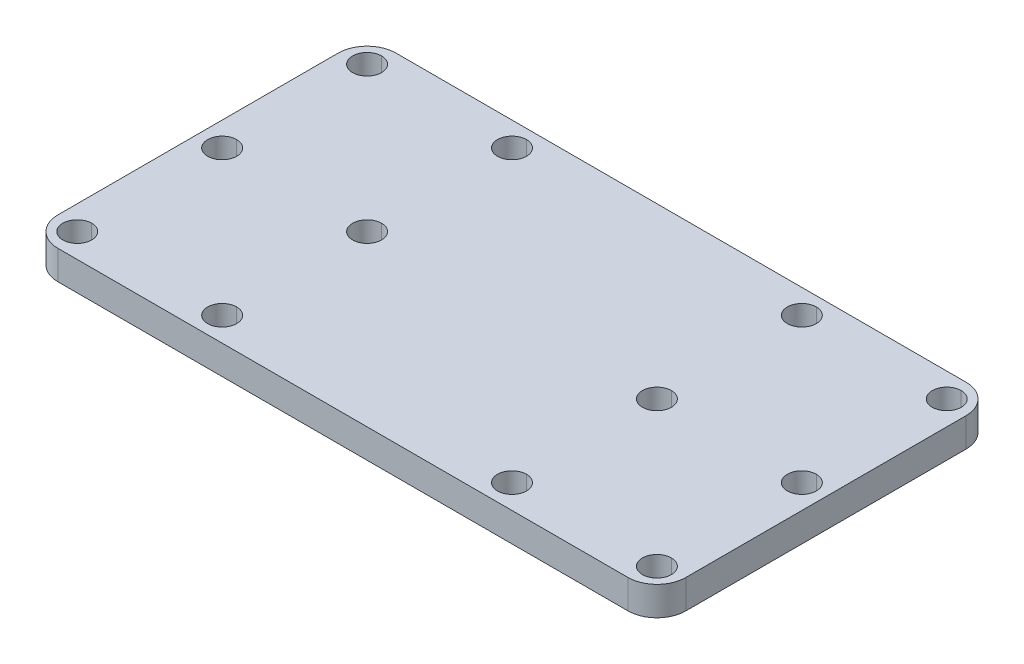
ISO-10303-21;
HEADER;
FILE_DESCRIPTION(('STEP AP214'),'2;1');
FILE_NAME('part.step','',(''),(''),'','','');
FILE_SCHEMA(('AUTOMOTIVE_DESIGN { 1 0 10303 214 1 1 1 1 }'));
ENDSEC;
DATA;
#1=APPLICATION_CONTEXT('core data for automotive mechanical design processes');
#2=APPLICATION_PROTOCOL_DEFINITION('international standard','automotive_design',2000,#1);
#3=PRODUCT_CONTEXT('',#1,'mechanical');
#4=PRODUCT('Part','Part','',(#3));
#5=PRODUCT_RELATED_PRODUCT_CATEGORY('part','',(#4));
#6=PRODUCT_DEFINITION_FORMATION('','',#4);
#7=PRODUCT_DEFINITION_CONTEXT('part definition',#1,'design');
#8=PRODUCT_DEFINITION('design','',#6,#7);
#9=PRODUCT_DEFINITION_SHAPE('','',#8);
#10=(LENGTH_UNIT() NAMED_UNIT(*) SI_UNIT(.MILLI.,.METRE.));
#11=(NAMED_UNIT(*) PLANE_ANGLE_UNIT() SI_UNIT($,.RADIAN.));
#12=(NAMED_UNIT(*) SI_UNIT($,.STERADIAN.) SOLID_ANGLE_UNIT());
#13=UNCERTAINTY_MEASURE_WITH_UNIT(LENGTH_MEASURE(1.E-05),#10,'distance_accuracy_value','');
#14=(GEOMETRIC_REPRESENTATION_CONTEXT(3) GLOBAL_UNCERTAINTY_ASSIGNED_CONTEXT((#13)) GLOBAL_UNIT_ASSIGNED_CONTEXT((#10,
#11,#12)) REPRESENTATION_CONTEXT('',''));
#15=CARTESIAN_POINT('',(0.,0.,0.));
#16=DIRECTION('',(0.,0.,1.));
#17=DIRECTION('',(1.,0.,0.));
#18=AXIS2_PLACEMENT_3D('',#15,#16,#17);
#19=CARTESIAN_POINT('',(-15.,-7.,-15.));
#20=DIRECTION('',(0.,1.,0.));
#21=DIRECTION('',(0.,0.,1.));
#22=AXIS2_PLACEMENT_3D('',#19,#20,#21);
#23=CYLINDRICAL_SURFACE('',#22,1.5);
#24=DIRECTION('',(0.,1.,0.));
#25=VECTOR('',#24,1.);
#26=CARTESIAN_POINT('',(-15.,-7.,-16.5));
#27=LINE('',#26,#25);
#28=CARTESIAN_POINT('',(-15.,0.,-16.5));
#29=VERTEX_POINT('',#28);
#30=CARTESIAN_POINT('',(-15.,3.,-16.5));
#31=VERTEX_POINT('',#30);
#32=EDGE_CURVE('E640',#29,#31,#27,.T.);
#33=ORIENTED_EDGE('',*,*,#32,.F.);
#34=CARTESIAN_POINT('',(-15.,0.,-15.));
#35=DIRECTION('',(0.,1.,0.));
#36=DIRECTION('',(0.,0.,1.));
#37=AXIS2_PLACEMENT_3D('',#34,#35,#36);
#38=CIRCLE('',#37,1.5);
#39=CARTESIAN_POINT('',(-15.,0.,-13.5));
#40=VERTEX_POINT('',#39);
#41=EDGE_CURVE('E222',#40,#29,#38,.T.);
#42=ORIENTED_EDGE('',*,*,#41,.F.);
#43=DIRECTION('',(0.,1.,0.));
#44=VECTOR('',#43,1.);
#45=CARTESIAN_POINT('',(-15.,-7.,-13.5));
#46=LINE('',#45,#44);
#47=CARTESIAN_POINT('',(-15.,3.,-13.5));
#48=VERTEX_POINT('',#47);
#49=EDGE_CURVE('E650',#40,#48,#46,.T.);
#50=ORIENTED_EDGE('',*,*,#49,.T.);
#51=CARTESIAN_POINT('',(-15.,3.,-15.));
#52=DIRECTION('',(0.,1.,0.));
#53=DIRECTION('',(0.,0.,1.));
#54=AXIS2_PLACEMENT_3D('',#51,#52,#53);
#55=CIRCLE('',#54,1.5);
#56=EDGE_CURVE('E200',#48,#31,#55,.T.);
#57=ORIENTED_EDGE('',*,*,#56,.T.);
#58=EDGE_LOOP('',(#33,#42,#50,#57));
#59=FACE_BOUND('',#58,.T.);
#60=ADVANCED_FACE('F16',(#59),#23,.F.);
#61=CARTESIAN_POINT('',(-15.,-7.,15.));
#62=DIRECTION('',(0.,1.,0.));
#63=DIRECTION('',(0.,0.,1.));
#64=AXIS2_PLACEMENT_3D('',#61,#62,#63);
#65=CYLINDRICAL_SURFACE('',#64,1.5);
#66=DIRECTION('',(0.,1.,0.));
#67=VECTOR('',#66,1.);
#68=CARTESIAN_POINT('',(-15.,-7.,13.5));
#69=LINE('',#68,#67);
#70=CARTESIAN_POINT('',(-15.,0.,13.5));
#71=VERTEX_POINT('',#70);
#72=CARTESIAN_POINT('',(-15.,3.,13.5));
#73=VERTEX_POINT('',#72);
#74=EDGE_CURVE('E665',#71,#73,#69,.T.);
#75=ORIENTED_EDGE('',*,*,#74,.F.);
#76=CARTESIAN_POINT('',(-15.,0.,15.));
#77=DIRECTION('',(0.,1.,0.));
#78=DIRECTION('',(0.,0.,1.));
#79=AXIS2_PLACEMENT_3D('',#76,#77,#78);
#80=CIRCLE('',#79,1.5);
#81=CARTESIAN_POINT('',(-15.,0.,16.5));
#82=VERTEX_POINT('',#81);
#83=EDGE_CURVE('E226',#82,#71,#80,.T.);
#84=ORIENTED_EDGE('',*,*,#83,.F.);
#85=DIRECTION('',(0.,1.,0.));
#86=VECTOR('',#85,1.);
#87=CARTESIAN_POINT('',(-15.,-7.,16.5));
#88=LINE('',#87,#86);
#89=CARTESIAN_POINT('',(-15.,3.,16.5));
#90=VERTEX_POINT('',#89);
#91=EDGE_CURVE('E664',#82,#90,#88,.T.);
#92=ORIENTED_EDGE('',*,*,#91,.T.);
#93=CARTESIAN_POINT('',(-15.,3.,15.));
#94=DIRECTION('',(0.,1.,0.));
#95=DIRECTION('',(0.,0.,1.));
#96=AXIS2_PLACEMENT_3D('',#93,#94,#95);
#97=CIRCLE('',#96,1.5);
#98=EDGE_CURVE('E213',#90,#73,#97,.T.);
#99=ORIENTED_EDGE('',*,*,#98,.T.);
#100=EDGE_LOOP('',(#75,#84,#92,#99));
#101=FACE_BOUND('',#100,.T.);
#102=ADVANCED_FACE('F704',(#101),#65,.F.);
#103=CARTESIAN_POINT('',(15.,-7.,-15.));
#104=DIRECTION('',(0.,1.,0.));
#105=DIRECTION('',(0.,0.,1.));
#106=AXIS2_PLACEMENT_3D('',#103,#104,#105);
#107=CYLINDRICAL_SURFACE('',#106,1.5);
#108=DIRECTION('',(0.,1.,0.));
#109=VECTOR('',#108,1.);
#110=CARTESIAN_POINT('',(15.,-7.,-16.5));
#111=LINE('',#110,#109);
#112=CARTESIAN_POINT('',(15.,0.,-16.5));
#113=VERTEX_POINT('',#112);
#114=CARTESIAN_POINT('',(15.,3.,-16.5));
#115=VERTEX_POINT('',#114);
#116=EDGE_CURVE('E380',#113,#115,#111,.T.);
#117=ORIENTED_EDGE('',*,*,#116,.F.);
#118=CARTESIAN_POINT('',(15.,0.,-15.));
#119=DIRECTION('',(0.,1.,0.));
#120=DIRECTION('',(0.,0.,1.));
#121=AXIS2_PLACEMENT_3D('',#118,#119,#120);
#122=CIRCLE('',#121,1.5);
#123=CARTESIAN_POINT('',(15.,0.,-13.5));
#124=VERTEX_POINT('',#123);
#125=EDGE_CURVE('E251',#124,#113,#122,.T.);
#126=ORIENTED_EDGE('',*,*,#125,.F.);
#127=DIRECTION('',(0.,1.,0.));
#128=VECTOR('',#127,1.);
#129=CARTESIAN_POINT('',(15.,-7.,-13.5));
#130=LINE('',#129,#128);
#131=CARTESIAN_POINT('',(15.,3.,-13.5));
#132=VERTEX_POINT('',#131);
#133=EDGE_CURVE('E391',#124,#132,#130,.T.);
#134=ORIENTED_EDGE('',*,*,#133,.T.);
#135=CARTESIAN_POINT('',(15.,3.,-15.));
#136=DIRECTION('',(0.,1.,0.));
#137=DIRECTION('',(0.,0.,1.));
#138=AXIS2_PLACEMENT_3D('',#135,#136,#137);
#139=CIRCLE('',#138,1.5);
#140=EDGE_CURVE('E217',#132,#115,#139,.T.);
#141=ORIENTED_EDGE('',*,*,#140,.T.);
#142=EDGE_LOOP('',(#117,#126,#134,#141));
#143=FACE_BOUND('',#142,.T.);
#144=ADVANCED_FACE('F750',(#143),#107,.F.);
#145=CARTESIAN_POINT('',(15.,-7.,15.));
#146=DIRECTION('',(0.,1.,0.));
#147=DIRECTION('',(0.,0.,1.));
#148=AXIS2_PLACEMENT_3D('',#145,#146,#147);
#149=CYLINDRICAL_SURFACE('',#148,1.5);
#150=DIRECTION('',(0.,1.,0.));
#151=VECTOR('',#150,1.);
#152=CARTESIAN_POINT('',(15.,-7.,13.5));
#153=LINE('',#152,#151);
#154=CARTESIAN_POINT('',(15.,0.,13.5));
#155=VERTEX_POINT('',#154);
#156=CARTESIAN_POINT('',(15.,3.,13.5));
#157=VERTEX_POINT('',#156);
#158=EDGE_CURVE('E402',#155,#157,#153,.T.);
#159=ORIENTED_EDGE('',*,*,#158,.F.);
#160=CARTESIAN_POINT('',(15.,0.,15.));
#161=DIRECTION('',(0.,1.,0.));
#162=DIRECTION('',(0.,0.,1.));
#163=AXIS2_PLACEMENT_3D('',#160,#161,#162);
#164=CIRCLE('',#163,1.5);
#165=CARTESIAN_POINT('',(15.,0.,16.5));
#166=VERTEX_POINT('',#165);
#167=EDGE_CURVE('E209',#166,#155,#164,.T.);
#168=ORIENTED_EDGE('',*,*,#167,.F.);
#169=DIRECTION('',(0.,1.,0.));
#170=VECTOR('',#169,1.);
#171=CARTESIAN_POINT('',(15.,-7.,16.5));
#172=LINE('',#171,#170);
#173=CARTESIAN_POINT('',(15.,3.,16.5));
#174=VERTEX_POINT('',#173);
#175=EDGE_CURVE('E414',#166,#174,#172,.T.);
#176=ORIENTED_EDGE('',*,*,#175,.T.);
#177=CARTESIAN_POINT('',(15.,3.,15.));
#178=DIRECTION('',(0.,1.,0.));
#179=DIRECTION('',(0.,0.,1.));
#180=AXIS2_PLACEMENT_3D('',#177,#178,#179);
#181=CIRCLE('',#180,1.5);
#182=EDGE_CURVE('E221',#174,#157,#181,.T.);
#183=ORIENTED_EDGE('',*,*,#182,.T.);
#184=EDGE_LOOP('',(#159,#168,#176,#183));
#185=FACE_BOUND('',#184,.T.);
#186=ADVANCED_FACE('F754',(#185),#149,.F.);
#187=CARTESIAN_POINT('',(30.,-7.,-15.));
#188=DIRECTION('',(0.,1.,0.));
#189=DIRECTION('',(0.,0.,1.));
#190=AXIS2_PLACEMENT_3D('',#187,#188,#189);
#191=CYLINDRICAL_SURFACE('',#190,1.5);
#192=DIRECTION('',(0.,1.,0.));
#193=VECTOR('',#192,1.);
#194=CARTESIAN_POINT('',(30.,-7.,-16.5));
#195=LINE('',#194,#193);
#196=CARTESIAN_POINT('',(30.,0.,-16.5));
#197=VERTEX_POINT('',#196);
#198=CARTESIAN_POINT('',(30.,3.,-16.5));
#199=VERTEX_POINT('',#198);
#200=EDGE_CURVE('E413',#197,#199,#195,.T.);
#201=ORIENTED_EDGE('',*,*,#200,.F.);
#202=CARTESIAN_POINT('',(30.,0.,-15.));
#203=DIRECTION('',(0.,1.,0.));
#204=DIRECTION('',(0.,0.,1.));
#205=AXIS2_PLACEMENT_3D('',#202,#203,#204);
#206=CIRCLE('',#205,1.5);
#207=CARTESIAN_POINT('',(30.,0.,-13.5));
#208=VERTEX_POINT('',#207);
#209=EDGE_CURVE('E204',#208,#197,#206,.T.);
#210=ORIENTED_EDGE('',*,*,#209,.F.);
#211=DIRECTION('',(0.,1.,0.));
#212=VECTOR('',#211,1.);
#213=CARTESIAN_POINT('',(30.,-7.,-13.5));
#214=LINE('',#213,#212);
#215=CARTESIAN_POINT('',(30.,3.,-13.5));
#216=VERTEX_POINT('',#215);
#217=EDGE_CURVE('E427',#208,#216,#214,.T.);
#218=ORIENTED_EDGE('',*,*,#217,.T.);
#219=CARTESIAN_POINT('',(30.,3.,-15.));
#220=DIRECTION('',(0.,1.,0.));
#221=DIRECTION('',(0.,0.,1.));
#222=AXIS2_PLACEMENT_3D('',#219,#220,#221);
#223=CIRCLE('',#222,1.5);
#224=EDGE_CURVE('E231',#216,#199,#223,.T.);
#225=ORIENTED_EDGE('',*,*,#224,.T.);
#226=EDGE_LOOP('',(#201,#210,#218,#225));
#227=FACE_BOUND('',#226,.T.);
#228=ADVANCED_FACE('F758',(#227),#191,.F.);
#229=CARTESIAN_POINT('',(30.,-7.,15.));
#230=DIRECTION('',(0.,1.,0.));
#231=DIRECTION('',(0.,0.,1.));
#232=AXIS2_PLACEMENT_3D('',#229,#230,#231);
#233=CYLINDRICAL_SURFACE('',#232,1.5);
#234=DIRECTION('',(0.,1.,0.));
#235=VECTOR('',#234,1.);
#236=CARTESIAN_POINT('',(30.,-7.,13.5));
#237=LINE('',#236,#235);
#238=CARTESIAN_POINT('',(30.,0.,13.5));
#239=VERTEX_POINT('',#238);
#240=CARTESIAN_POINT('',(30.,3.,13.5));
#241=VERTEX_POINT('',#240);
#242=EDGE_CURVE('E436',#239,#241,#237,.T.);
#243=ORIENTED_EDGE('',*,*,#242,.F.);
#244=CARTESIAN_POINT('',(30.,0.,15.));
#245=DIRECTION('',(0.,1.,0.));
#246=DIRECTION('',(0.,0.,1.));
#247=AXIS2_PLACEMENT_3D('',#244,#245,#246);
#248=CIRCLE('',#247,1.5);
#249=CARTESIAN_POINT('',(30.,0.,16.5));
#250=VERTEX_POINT('',#249);
#251=EDGE_CURVE('E208',#250,#239,#248,.T.);
#252=ORIENTED_EDGE('',*,*,#251,.F.);
#253=DIRECTION('',(0.,1.,0.));
#254=VECTOR('',#253,1.);
#255=CARTESIAN_POINT('',(30.,-7.,16.5));
#256=LINE('',#255,#254);
#257=CARTESIAN_POINT('',(30.,3.,16.5));
#258=VERTEX_POINT('',#257);
#259=EDGE_CURVE('E444',#250,#258,#256,.T.);
#260=ORIENTED_EDGE('',*,*,#259,.T.);
#261=CARTESIAN_POINT('',(30.,3.,15.));
#262=DIRECTION('',(0.,1.,0.));
#263=DIRECTION('',(0.,0.,1.));
#264=AXIS2_PLACEMENT_3D('',#261,#262,#263);
#265=CIRCLE('',#264,1.5);
#266=EDGE_CURVE('E232',#258,#241,#265,.T.);
#267=ORIENTED_EDGE('',*,*,#266,.T.);
#268=EDGE_LOOP('',(#243,#252,#260,#267));
#269=FACE_BOUND('',#268,.T.);
#270=ADVANCED_FACE('F724',(#269),#233,.F.);
#271=CARTESIAN_POINT('',(-30.,-7.,-15.));
#272=DIRECTION('',(0.,1.,0.));
#273=DIRECTION('',(0.,0.,1.));
#274=AXIS2_PLACEMENT_3D('',#271,#272,#273);
#275=CYLINDRICAL_SURFACE('',#274,1.5);
#276=DIRECTION('',(0.,1.,0.));
#277=VECTOR('',#276,1.);
#278=CARTESIAN_POINT('',(-30.,-7.,-16.5));
#279=LINE('',#278,#277);
#280=CARTESIAN_POINT('',(-30.,0.,-16.5));
#281=VERTEX_POINT('',#280);
#282=CARTESIAN_POINT('',(-30.,3.,-16.5));
#283=VERTEX_POINT('',#282);
#284=EDGE_CURVE('E455',#281,#283,#279,.T.);
#285=ORIENTED_EDGE('',*,*,#284,.F.);
#286=CARTESIAN_POINT('',(-30.,0.,-15.));
#287=DIRECTION('',(0.,1.,0.));
#288=DIRECTION('',(0.,0.,1.));
#289=AXIS2_PLACEMENT_3D('',#286,#287,#288);
#290=CIRCLE('',#289,1.5);
#291=CARTESIAN_POINT('',(-30.,0.,-13.5));
#292=VERTEX_POINT('',#291);
#293=EDGE_CURVE('E258',#292,#281,#290,.T.);
#294=ORIENTED_EDGE('',*,*,#293,.F.);
#295=DIRECTION('',(0.,1.,0.));
#296=VECTOR('',#295,1.);
#297=CARTESIAN_POINT('',(-30.,-7.,-13.5));
#298=LINE('',#297,#296);
#299=CARTESIAN_POINT('',(-30.,3.,-13.5));
#300=VERTEX_POINT('',#299);
#301=EDGE_CURVE('E465',#292,#300,#298,.T.);
#302=ORIENTED_EDGE('',*,*,#301,.T.);
#303=CARTESIAN_POINT('',(-30.,3.,-15.));
#304=DIRECTION('',(0.,1.,0.));
#305=DIRECTION('',(0.,0.,1.));
#306=AXIS2_PLACEMENT_3D('',#303,#304,#305);
#307=CIRCLE('',#306,1.5);
#308=EDGE_CURVE('E236',#300,#283,#307,.T.);
#309=ORIENTED_EDGE('',*,*,#308,.T.);
#310=EDGE_LOOP('',(#285,#294,#302,#309));
#311=FACE_BOUND('',#310,.T.);
#312=ADVANCED_FACE('F764',(#311),#275,.F.);
#313=CARTESIAN_POINT('',(-30.,-7.,15.));
#314=DIRECTION('',(0.,1.,0.));
#315=DIRECTION('',(0.,0.,1.));
#316=AXIS2_PLACEMENT_3D('',#313,#314,#315);
#317=CYLINDRICAL_SURFACE('',#316,1.5);
#318=DIRECTION('',(0.,1.,0.));
#319=VECTOR('',#318,1.);
#320=CARTESIAN_POINT('',(-30.,-7.,13.5));
#321=LINE('',#320,#319);
#322=CARTESIAN_POINT('',(-30.,0.,13.5));
#323=VERTEX_POINT('',#322);
#324=CARTESIAN_POINT('',(-30.,3.,13.5));
#325=VERTEX_POINT('',#324);
#326=EDGE_CURVE('E476',#323,#325,#321,.T.);
#327=ORIENTED_EDGE('',*,*,#326,.F.);
#328=CARTESIAN_POINT('',(-30.,0.,15.));
#329=DIRECTION('',(0.,1.,0.));
#330=DIRECTION('',(0.,0.,1.));
#331=AXIS2_PLACEMENT_3D('',#328,#329,#330);
#332=CIRCLE('',#331,1.5);
#333=CARTESIAN_POINT('',(-30.,0.,16.5));
#334=VERTEX_POINT('',#333);
#335=EDGE_CURVE('E262',#334,#323,#332,.T.);
#336=ORIENTED_EDGE('',*,*,#335,.F.);
#337=DIRECTION('',(0.,1.,0.));
#338=VECTOR('',#337,1.);
#339=CARTESIAN_POINT('',(-30.,-7.,16.5));
#340=LINE('',#339,#338);
#341=CARTESIAN_POINT('',(-30.,3.,16.5));
#342=VERTEX_POINT('',#341);
#343=EDGE_CURVE('E487',#334,#342,#340,.T.);
#344=ORIENTED_EDGE('',*,*,#343,.T.);
#345=CARTESIAN_POINT('',(-30.,3.,15.));
#346=DIRECTION('',(0.,1.,0.));
#347=DIRECTION('',(0.,0.,1.));
#348=AXIS2_PLACEMENT_3D('',#345,#346,#347);
#349=CIRCLE('',#348,1.5);
#350=EDGE_CURVE('E241',#342,#325,#349,.T.);
#351=ORIENTED_EDGE('',*,*,#350,.T.);
#352=EDGE_LOOP('',(#327,#336,#344,#351));
#353=FACE_BOUND('',#352,.T.);
#354=ADVANCED_FACE('F599',(#353),#317,.F.);
#355=CARTESIAN_POINT('',(-29.5,3.,-14.5));
#356=DIRECTION('',(0.,-1.,0.));
#357=DIRECTION('',(0.,0.,-1.));
#358=AXIS2_PLACEMENT_3D('',#355,#356,#357);
#359=CYLINDRICAL_SURFACE('',#358,3.);
#360=CARTESIAN_POINT('',(-29.5,3.,-14.5));
#361=DIRECTION('',(0.,1.,0.));
#362=DIRECTION('',(0.,0.,1.));
#363=AXIS2_PLACEMENT_3D('',#360,#361,#362);
#364=CIRCLE('',#363,3.);
#365=CARTESIAN_POINT('',(-29.5,3.,-17.5));
#366=VERTEX_POINT('',#365);
#367=CARTESIAN_POINT('',(-32.5,3.,-14.5));
#368=VERTEX_POINT('',#367);
#369=EDGE_CURVE('E311',#366,#368,#364,.T.);
#370=ORIENTED_EDGE('',*,*,#369,.F.);
#371=DIRECTION('',(0.,1.,0.));
#372=VECTOR('',#371,1.);
#373=CARTESIAN_POINT('',(-29.5,3.,-17.5));
#374=LINE('',#373,#372);
#375=CARTESIAN_POINT('',(-29.5,0.,-17.5));
#376=VERTEX_POINT('',#375);
#377=EDGE_CURVE('E355',#376,#366,#374,.T.);
#378=ORIENTED_EDGE('',*,*,#377,.F.);
#379=CARTESIAN_POINT('',(-29.5,0.,-14.5));
#380=DIRECTION('',(0.,-1.,0.));
#381=DIRECTION('',(0.,0.,1.));
#382=AXIS2_PLACEMENT_3D('',#379,#380,#381);
#383=CIRCLE('',#382,3.);
#384=CARTESIAN_POINT('',(-32.5,0.,-14.5));
#385=VERTEX_POINT('',#384);
#386=EDGE_CURVE('E227',#385,#376,#383,.T.);
#387=ORIENTED_EDGE('',*,*,#386,.F.);
#388=DIRECTION('',(0.,-1.,0.));
#389=VECTOR('',#388,1.);
#390=CARTESIAN_POINT('',(-32.5,3.,-14.5));
#391=LINE('',#390,#389);
#392=EDGE_CURVE('E183',#368,#385,#391,.T.);
#393=ORIENTED_EDGE('',*,*,#392,.F.);
#394=EDGE_LOOP('',(#370,#378,#387,#393));
#395=FACE_BOUND('',#394,.T.);
#396=ADVANCED_FACE('F768',(#395),#359,.T.);
#397=CARTESIAN_POINT('',(-29.5,3.,14.5));
#398=DIRECTION('',(0.,-1.,0.));
#399=DIRECTION('',(0.,0.,-1.));
#400=AXIS2_PLACEMENT_3D('',#397,#398,#399);
#401=CYLINDRICAL_SURFACE('',#400,3.);
#402=CARTESIAN_POINT('',(-29.5,3.,14.5));
#403=DIRECTION('',(0.,1.,0.));
#404=DIRECTION('',(0.,0.,1.));
#405=AXIS2_PLACEMENT_3D('',#402,#403,#404);
#406=CIRCLE('',#405,3.);
#407=CARTESIAN_POINT('',(-32.5,3.,14.5));
#408=VERTEX_POINT('',#407);
#409=CARTESIAN_POINT('',(-29.5,3.,17.5));
#410=VERTEX_POINT('',#409);
#411=EDGE_CURVE('E38',#408,#410,#406,.T.);
#412=ORIENTED_EDGE('',*,*,#411,.F.);
#413=DIRECTION('',(0.,1.,0.));
#414=VECTOR('',#413,1.);
#415=CARTESIAN_POINT('',(-32.5,3.,14.5));
#416=LINE('',#415,#414);
#417=CARTESIAN_POINT('',(-32.5,0.,14.5));
#418=VERTEX_POINT('',#417);
#419=EDGE_CURVE('E366',#418,#408,#416,.T.);
#420=ORIENTED_EDGE('',*,*,#419,.F.);
#421=CARTESIAN_POINT('',(-29.5,0.,14.5));
#422=DIRECTION('',(0.,-1.,0.));
#423=DIRECTION('',(0.,0.,1.));
#424=AXIS2_PLACEMENT_3D('',#421,#422,#423);
#425=CIRCLE('',#424,3.);
#426=CARTESIAN_POINT('',(-29.5,0.,17.5));
#427=VERTEX_POINT('',#426);
#428=EDGE_CURVE('E167',#427,#418,#425,.T.);
#429=ORIENTED_EDGE('',*,*,#428,.F.);
#430=DIRECTION('',(0.,-1.,0.));
#431=VECTOR('',#430,1.);
#432=CARTESIAN_POINT('',(-29.5,3.,17.5));
#433=LINE('',#432,#431);
#434=EDGE_CURVE('E181',#410,#427,#433,.T.);
#435=ORIENTED_EDGE('',*,*,#434,.F.);
#436=EDGE_LOOP('',(#412,#420,#429,#435));
#437=FACE_BOUND('',#436,.T.);
#438=ADVANCED_FACE('F771',(#437),#401,.T.);
#439=CARTESIAN_POINT('',(29.5,3.,14.5));
#440=DIRECTION('',(0.,-1.,0.));
#441=DIRECTION('',(0.,0.,-1.));
#442=AXIS2_PLACEMENT_3D('',#439,#440,#441);
#443=CYLINDRICAL_SURFACE('',#442,3.);
#444=CARTESIAN_POINT('',(29.5,3.,14.5));
#445=DIRECTION('',(0.,1.,0.));
#446=DIRECTION('',(0.,0.,1.));
#447=AXIS2_PLACEMENT_3D('',#444,#445,#446);
#448=CIRCLE('',#447,3.);
#449=CARTESIAN_POINT('',(29.5,3.,17.5));
#450=VERTEX_POINT('',#449);
#451=CARTESIAN_POINT('',(32.5,3.,14.5));
#452=VERTEX_POINT('',#451);
#453=EDGE_CURVE('E173',#450,#452,#448,.T.);
#454=ORIENTED_EDGE('',*,*,#453,.F.);
#455=DIRECTION('',(0.,1.,0.));
#456=VECTOR('',#455,1.);
#457=CARTESIAN_POINT('',(29.5,3.,17.5));
#458=LINE('',#457,#456);
#459=CARTESIAN_POINT('',(29.5,0.,17.5));
#460=VERTEX_POINT('',#459);
#461=EDGE_CURVE('E171',#460,#450,#458,.T.);
#462=ORIENTED_EDGE('',*,*,#461,.F.);
#463=CARTESIAN_POINT('',(29.5,0.,14.5));
#464=DIRECTION('',(0.,-1.,0.));
#465=DIRECTION('',(0.,0.,1.));
#466=AXIS2_PLACEMENT_3D('',#463,#464,#465);
#467=CIRCLE('',#466,3.);
#468=CARTESIAN_POINT('',(32.5,0.,14.5));
#469=VERTEX_POINT('',#468);
#470=EDGE_CURVE('E154',#469,#460,#467,.T.);
#471=ORIENTED_EDGE('',*,*,#470,.F.);
#472=DIRECTION('',(0.,-1.,0.));
#473=VECTOR('',#472,1.);
#474=CARTESIAN_POINT('',(32.5,3.,14.5));
#475=LINE('',#474,#473);
#476=EDGE_CURVE('E344',#452,#469,#475,.T.);
#477=ORIENTED_EDGE('',*,*,#476,.F.);
#478=EDGE_LOOP('',(#454,#462,#471,#477));
#479=FACE_BOUND('',#478,.T.);
#480=ADVANCED_FACE('F172',(#479),#443,.T.);
#481=CARTESIAN_POINT('',(29.5,3.,-14.5));
#482=DIRECTION('',(0.,-1.,0.));
#483=DIRECTION('',(0.,0.,-1.));
#484=AXIS2_PLACEMENT_3D('',#481,#482,#483);
#485=CYLINDRICAL_SURFACE('',#484,3.);
#486=CARTESIAN_POINT('',(29.5,3.,-14.5));
#487=DIRECTION('',(0.,1.,0.));
#488=DIRECTION('',(0.,0.,1.));
#489=AXIS2_PLACEMENT_3D('',#486,#487,#488);
#490=CIRCLE('',#489,3.);
#491=CARTESIAN_POINT('',(32.5,3.,-14.5));
#492=VERTEX_POINT('',#491);
#493=CARTESIAN_POINT('',(29.5,3.,-17.5));
#494=VERTEX_POINT('',#493);
#495=EDGE_CURVE('E197',#492,#494,#490,.T.);
#496=ORIENTED_EDGE('',*,*,#495,.F.);
#497=DIRECTION('',(0.,1.,0.));
#498=VECTOR('',#497,1.);
#499=CARTESIAN_POINT('',(32.5,3.,-14.5));
#500=LINE('',#499,#498);
#501=CARTESIAN_POINT('',(32.5,0.,-14.5));
#502=VERTEX_POINT('',#501);
#503=EDGE_CURVE('E339',#502,#492,#500,.T.);
#504=ORIENTED_EDGE('',*,*,#503,.F.);
#505=CARTESIAN_POINT('',(29.5,0.,-14.5));
#506=DIRECTION('',(0.,-1.,0.));
#507=DIRECTION('',(0.,0.,1.));
#508=AXIS2_PLACEMENT_3D('',#505,#506,#507);
#509=CIRCLE('',#508,3.);
#510=CARTESIAN_POINT('',(29.5,0.,-17.5));
#511=VERTEX_POINT('',#510);
#512=EDGE_CURVE('E168',#511,#502,#509,.T.);
#513=ORIENTED_EDGE('',*,*,#512,.F.);
#514=DIRECTION('',(0.,-1.,0.));
#515=VECTOR('',#514,1.);
#516=CARTESIAN_POINT('',(29.5,3.,-17.5));
#517=LINE('',#516,#515);
#518=EDGE_CURVE('E351',#494,#511,#517,.T.);
#519=ORIENTED_EDGE('',*,*,#518,.F.);
#520=EDGE_LOOP('',(#496,#504,#513,#519));
#521=FACE_BOUND('',#520,.T.);
#522=ADVANCED_FACE('F778',(#521),#485,.T.);
#523=CARTESIAN_POINT('',(-30.,-7.,0.));
#524=DIRECTION('',(0.,1.,0.));
#525=DIRECTION('',(0.,0.,1.));
#526=AXIS2_PLACEMENT_3D('',#523,#524,#525);
#527=CYLINDRICAL_SURFACE('',#526,1.5);
#528=DIRECTION('',(0.,1.,0.));
#529=VECTOR('',#528,1.);
#530=CARTESIAN_POINT('',(-30.,-7.,-1.5));
#531=LINE('',#530,#529);
#532=CARTESIAN_POINT('',(-30.,0.,-1.5));
#533=VERTEX_POINT('',#532);
#534=CARTESIAN_POINT('',(-30.,3.,-1.5));
#535=VERTEX_POINT('',#534);
#536=EDGE_CURVE('E495',#533,#535,#531,.T.);
#537=ORIENTED_EDGE('',*,*,#536,.F.);
#538=CARTESIAN_POINT('',(-30.,0.,0.));
#539=DIRECTION('',(0.,1.,0.));
#540=DIRECTION('',(0.,0.,1.));
#541=AXIS2_PLACEMENT_3D('',#538,#539,#540);
#542=CIRCLE('',#541,1.5);
#543=CARTESIAN_POINT('',(-30.,0.,1.5));
#544=VERTEX_POINT('',#543);
#545=EDGE_CURVE('E266',#544,#533,#542,.T.);
#546=ORIENTED_EDGE('',*,*,#545,.F.);
#547=DIRECTION('',(0.,1.,0.));
#548=VECTOR('',#547,1.);
#549=CARTESIAN_POINT('',(-30.,-7.,1.5));
#550=LINE('',#549,#548);
#551=CARTESIAN_POINT('',(-30.,3.,1.5));
#552=VERTEX_POINT('',#551);
#553=EDGE_CURVE('E293',#544,#552,#550,.T.);
#554=ORIENTED_EDGE('',*,*,#553,.T.);
#555=CARTESIAN_POINT('',(-30.,3.,0.));
#556=DIRECTION('',(0.,1.,0.));
#557=DIRECTION('',(0.,0.,1.));
#558=AXIS2_PLACEMENT_3D('',#555,#556,#557);
#559=CIRCLE('',#558,1.5);
#560=EDGE_CURVE('E237',#552,#535,#559,.T.);
#561=ORIENTED_EDGE('',*,*,#560,.T.);
#562=EDGE_LOOP('',(#537,#546,#554,#561));
#563=FACE_BOUND('',#562,.T.);
#564=ADVANCED_FACE('F516',(#563),#527,.F.);
#565=CARTESIAN_POINT('',(-15.,-7.,0.));
#566=DIRECTION('',(0.,1.,0.));
#567=DIRECTION('',(0.,0.,1.));
#568=AXIS2_PLACEMENT_3D('',#565,#566,#567);
#569=CYLINDRICAL_SURFACE('',#568,1.5);
#570=DIRECTION('',(0.,1.,0.));
#571=VECTOR('',#570,1.);
#572=CARTESIAN_POINT('',(-15.,-7.,-1.5));
#573=LINE('',#572,#571);
#574=CARTESIAN_POINT('',(-15.,0.,-1.5));
#575=VERTEX_POINT('',#574);
#576=CARTESIAN_POINT('',(-15.,3.,-1.5));
#577=VERTEX_POINT('',#576);
#578=EDGE_CURVE('E282',#575,#577,#573,.T.);
#579=ORIENTED_EDGE('',*,*,#578,.F.);
#580=CARTESIAN_POINT('',(-15.,0.,0.));
#581=DIRECTION('',(0.,1.,0.));
#582=DIRECTION('',(0.,0.,1.));
#583=AXIS2_PLACEMENT_3D('',#580,#581,#582);
#584=CIRCLE('',#583,1.5);
#585=CARTESIAN_POINT('',(-15.,0.,1.5));
#586=VERTEX_POINT('',#585);
#587=EDGE_CURVE('E203',#586,#575,#584,.T.);
#588=ORIENTED_EDGE('',*,*,#587,.F.);
#589=DIRECTION('',(0.,1.,0.));
#590=VECTOR('',#589,1.);
#591=CARTESIAN_POINT('',(-15.,-7.,1.5));
#592=LINE('',#591,#590);
#593=CARTESIAN_POINT('',(-15.,3.,1.5));
#594=VERTEX_POINT('',#593);
#595=EDGE_CURVE('E291',#586,#594,#592,.T.);
#596=ORIENTED_EDGE('',*,*,#595,.T.);
#597=CARTESIAN_POINT('',(-15.,3.,0.));
#598=DIRECTION('',(0.,1.,0.));
#599=DIRECTION('',(0.,0.,1.));
#600=AXIS2_PLACEMENT_3D('',#597,#598,#599);
#601=CIRCLE('',#600,1.5);
#602=EDGE_CURVE('E240',#594,#577,#601,.T.);
#603=ORIENTED_EDGE('',*,*,#602,.T.);
#604=EDGE_LOOP('',(#579,#588,#596,#603));
#605=FACE_BOUND('',#604,.T.);
#606=ADVANCED_FACE('F283',(#605),#569,.F.);
#607=CARTESIAN_POINT('',(15.,-7.,0.));
#608=DIRECTION('',(0.,1.,0.));
#609=DIRECTION('',(0.,0.,1.));
#610=AXIS2_PLACEMENT_3D('',#607,#608,#609);
#611=CYLINDRICAL_SURFACE('',#610,1.5);
#612=DIRECTION('',(0.,1.,0.));
#613=VECTOR('',#612,1.);
#614=CARTESIAN_POINT('',(15.,-7.,-1.5));
#615=LINE('',#614,#613);
#616=CARTESIAN_POINT('',(15.,0.,-1.5));
#617=VERTEX_POINT('',#616);
#618=CARTESIAN_POINT('',(15.,3.,-1.5));
#619=VERTEX_POINT('',#618);
#620=EDGE_CURVE('E312',#617,#619,#615,.T.);
#621=ORIENTED_EDGE('',*,*,#620,.F.);
#622=CARTESIAN_POINT('',(15.,0.,0.));
#623=DIRECTION('',(0.,1.,0.));
#624=DIRECTION('',(0.,0.,1.));
#625=AXIS2_PLACEMENT_3D('',#622,#623,#624);
#626=CIRCLE('',#625,1.5);
#627=CARTESIAN_POINT('',(15.,0.,1.5));
#628=VERTEX_POINT('',#627);
#629=EDGE_CURVE('E25',#628,#617,#626,.T.);
#630=ORIENTED_EDGE('',*,*,#629,.F.);
#631=DIRECTION('',(0.,1.,0.));
#632=VECTOR('',#631,1.);
#633=CARTESIAN_POINT('',(15.,-7.,1.5));
#634=LINE('',#633,#632);
#635=CARTESIAN_POINT('',(15.,3.,1.5));
#636=VERTEX_POINT('',#635);
#637=EDGE_CURVE('E320',#628,#636,#634,.T.);
#638=ORIENTED_EDGE('',*,*,#637,.T.);
#639=CARTESIAN_POINT('',(15.,3.,0.));
#640=DIRECTION('',(0.,1.,0.));
#641=DIRECTION('',(0.,0.,1.));
#642=AXIS2_PLACEMENT_3D('',#639,#640,#641);
#643=CIRCLE('',#642,1.5);
#644=EDGE_CURVE('E246',#636,#619,#643,.T.);
#645=ORIENTED_EDGE('',*,*,#644,.T.);
#646=EDGE_LOOP('',(#621,#630,#638,#645));
#647=FACE_BOUND('',#646,.T.);
#648=ADVANCED_FACE('F783',(#647),#611,.F.);
#649=CARTESIAN_POINT('',(30.,-7.,0.));
#650=DIRECTION('',(0.,1.,0.));
#651=DIRECTION('',(0.,0.,1.));
#652=AXIS2_PLACEMENT_3D('',#649,#650,#651);
#653=CYLINDRICAL_SURFACE('',#652,1.5);
#654=DIRECTION('',(0.,1.,0.));
#655=VECTOR('',#654,1.);
#656=CARTESIAN_POINT('',(30.,-7.,-1.5));
#657=LINE('',#656,#655);
#658=CARTESIAN_POINT('',(30.,0.,-1.5));
#659=VERTEX_POINT('',#658);
#660=CARTESIAN_POINT('',(30.,3.,-1.5));
#661=VERTEX_POINT('',#660);
#662=EDGE_CURVE('E328',#659,#661,#657,.T.);
#663=ORIENTED_EDGE('',*,*,#662,.F.);
#664=CARTESIAN_POINT('',(30.,0.,0.));
#665=DIRECTION('',(0.,1.,0.));
#666=DIRECTION('',(0.,0.,1.));
#667=AXIS2_PLACEMENT_3D('',#664,#665,#666);
#668=CIRCLE('',#667,1.5);
#669=CARTESIAN_POINT('',(30.,0.,1.5));
#670=VERTEX_POINT('',#669);
#671=EDGE_CURVE('E10',#670,#659,#668,.T.);
#672=ORIENTED_EDGE('',*,*,#671,.F.);
#673=DIRECTION('',(0.,1.,0.));
#674=VECTOR('',#673,1.);
#675=CARTESIAN_POINT('',(30.,-7.,1.5));
#676=LINE('',#675,#674);
#677=CARTESIAN_POINT('',(30.,3.,1.5));
#678=VERTEX_POINT('',#677);
#679=EDGE_CURVE('E336',#670,#678,#676,.T.);
#680=ORIENTED_EDGE('',*,*,#679,.T.);
#681=CARTESIAN_POINT('',(30.,3.,0.));
#682=DIRECTION('',(0.,1.,0.));
#683=DIRECTION('',(0.,0.,1.));
#684=AXIS2_PLACEMENT_3D('',#681,#682,#683);
#685=CIRCLE('',#684,1.5);
#686=EDGE_CURVE('E242',#678,#661,#685,.T.);
#687=ORIENTED_EDGE('',*,*,#686,.T.);
#688=EDGE_LOOP('',(#663,#672,#680,#687));
#689=FACE_BOUND('',#688,.T.);
#690=ADVANCED_FACE('F606',(#689),#653,.F.);
#691=CARTESIAN_POINT('',(0.,0.,0.));
#692=DIRECTION('',(0.,1.,0.));
#693=DIRECTION('',(1.,0.,0.));
#694=AXIS2_PLACEMENT_3D('',#691,#692,#693);
#695=PLANE('',#694);
#696=ORIENTED_EDGE('',*,*,#671,.T.);
#697=CARTESIAN_POINT('',(30.,0.,0.));
#698=DIRECTION('',(0.,1.,0.));
#699=DIRECTION('',(0.,0.,1.));
#700=AXIS2_PLACEMENT_3D('',#697,#698,#699);
#701=CIRCLE('',#700,1.5);
#702=EDGE_CURVE('E324',#659,#670,#701,.T.);
#703=ORIENTED_EDGE('',*,*,#702,.T.);
#704=EDGE_LOOP('',(#696,#703));
#705=FACE_BOUND('',#704,.T.);
#706=ORIENTED_EDGE('',*,*,#629,.T.);
#707=CARTESIAN_POINT('',(15.,0.,0.));
#708=DIRECTION('',(0.,1.,0.));
#709=DIRECTION('',(0.,0.,1.));
#710=AXIS2_PLACEMENT_3D('',#707,#708,#709);
#711=CIRCLE('',#710,1.5);
#712=EDGE_CURVE('E308',#617,#628,#711,.T.);
#713=ORIENTED_EDGE('',*,*,#712,.T.);
#714=EDGE_LOOP('',(#706,#713));
#715=FACE_BOUND('',#714,.T.);
#716=ORIENTED_EDGE('',*,*,#587,.T.);
#717=CARTESIAN_POINT('',(-15.,0.,0.));
#718=DIRECTION('',(0.,1.,0.));
#719=DIRECTION('',(0.,0.,1.));
#720=AXIS2_PLACEMENT_3D('',#717,#718,#719);
#721=CIRCLE('',#720,1.5);
#722=EDGE_CURVE('E277',#575,#586,#721,.T.);
#723=ORIENTED_EDGE('',*,*,#722,.T.);
#724=EDGE_LOOP('',(#716,#723));
#725=FACE_BOUND('',#724,.T.);
#726=ORIENTED_EDGE('',*,*,#545,.T.);
#727=CARTESIAN_POINT('',(-30.,0.,0.));
#728=DIRECTION('',(0.,1.,0.));
#729=DIRECTION('',(0.,0.,1.));
#730=AXIS2_PLACEMENT_3D('',#727,#728,#729);
#731=CIRCLE('',#730,1.5);
#732=EDGE_CURVE('E491',#533,#544,#731,.T.);
#733=ORIENTED_EDGE('',*,*,#732,.T.);
#734=EDGE_LOOP('',(#726,#733));
#735=FACE_BOUND('',#734,.T.);
#736=ORIENTED_EDGE('',*,*,#335,.T.);
#737=CARTESIAN_POINT('',(-30.,0.,15.));
#738=DIRECTION('',(0.,1.,0.));
#739=DIRECTION('',(0.,0.,1.));
#740=AXIS2_PLACEMENT_3D('',#737,#738,#739);
#741=CIRCLE('',#740,1.5);
#742=EDGE_CURVE('E472',#323,#334,#741,.T.);
#743=ORIENTED_EDGE('',*,*,#742,.T.);
#744=EDGE_LOOP('',(#736,#743));
#745=FACE_BOUND('',#744,.T.);
#746=ORIENTED_EDGE('',*,*,#293,.T.);
#747=CARTESIAN_POINT('',(-30.,0.,-15.));
#748=DIRECTION('',(0.,1.,0.));
#749=DIRECTION('',(0.,0.,1.));
#750=AXIS2_PLACEMENT_3D('',#747,#748,#749);
#751=CIRCLE('',#750,1.5);
#752=EDGE_CURVE('E448',#281,#292,#751,.T.);
#753=ORIENTED_EDGE('',*,*,#752,.T.);
#754=EDGE_LOOP('',(#746,#753));
#755=FACE_BOUND('',#754,.T.);
#756=ORIENTED_EDGE('',*,*,#251,.T.);
#757=CARTESIAN_POINT('',(30.,0.,15.));
#758=DIRECTION('',(0.,1.,0.));
#759=DIRECTION('',(0.,0.,1.));
#760=AXIS2_PLACEMENT_3D('',#757,#758,#759);
#761=CIRCLE('',#760,1.5);
#762=EDGE_CURVE('E432',#239,#250,#761,.T.);
#763=ORIENTED_EDGE('',*,*,#762,.T.);
#764=EDGE_LOOP('',(#756,#763));
#765=FACE_BOUND('',#764,.T.);
#766=ORIENTED_EDGE('',*,*,#209,.T.);
#767=CARTESIAN_POINT('',(30.,0.,-15.));
#768=DIRECTION('',(0.,1.,0.));
#769=DIRECTION('',(0.,0.,1.));
#770=AXIS2_PLACEMENT_3D('',#767,#768,#769);
#771=CIRCLE('',#770,1.5);
#772=EDGE_CURVE('E409',#197,#208,#771,.T.);
#773=ORIENTED_EDGE('',*,*,#772,.T.);
#774=EDGE_LOOP('',(#766,#773));
#775=FACE_BOUND('',#774,.T.);
#776=ORIENTED_EDGE('',*,*,#167,.T.);
#777=CARTESIAN_POINT('',(15.,0.,15.));
#778=DIRECTION('',(0.,1.,0.));
#779=DIRECTION('',(0.,0.,1.));
#780=AXIS2_PLACEMENT_3D('',#777,#778,#779);
#781=CIRCLE('',#780,1.5);
#782=EDGE_CURVE('E398',#155,#166,#781,.T.);
#783=ORIENTED_EDGE('',*,*,#782,.T.);
#784=EDGE_LOOP('',(#776,#783));
#785=FACE_BOUND('',#784,.T.);
#786=ORIENTED_EDGE('',*,*,#125,.T.);
#787=CARTESIAN_POINT('',(15.,0.,-15.));
#788=DIRECTION('',(0.,1.,0.));
#789=DIRECTION('',(0.,0.,1.));
#790=AXIS2_PLACEMENT_3D('',#787,#788,#789);
#791=CIRCLE('',#790,1.5);
#792=EDGE_CURVE('E384',#113,#124,#791,.T.);
#793=ORIENTED_EDGE('',*,*,#792,.T.);
#794=EDGE_LOOP('',(#786,#793));
#795=FACE_BOUND('',#794,.T.);
#796=ORIENTED_EDGE('',*,*,#83,.T.);
#797=CARTESIAN_POINT('',(-15.,0.,15.));
#798=DIRECTION('',(0.,1.,0.));
#799=DIRECTION('',(0.,0.,1.));
#800=AXIS2_PLACEMENT_3D('',#797,#798,#799);
#801=CIRCLE('',#800,1.5);
#802=EDGE_CURVE('E682',#71,#82,#801,.T.);
#803=ORIENTED_EDGE('',*,*,#802,.T.);
#804=EDGE_LOOP('',(#796,#803));
#805=FACE_BOUND('',#804,.T.);
#806=ORIENTED_EDGE('',*,*,#41,.T.);
#807=CARTESIAN_POINT('',(-15.,0.,-15.));
#808=DIRECTION('',(0.,1.,0.));
#809=DIRECTION('',(0.,0.,1.));
#810=AXIS2_PLACEMENT_3D('',#807,#808,#809);
#811=CIRCLE('',#810,1.5);
#812=EDGE_CURVE('E633',#29,#40,#811,.T.);
#813=ORIENTED_EDGE('',*,*,#812,.T.);
#814=EDGE_LOOP('',(#806,#813));
#815=FACE_BOUND('',#814,.T.);
#816=DIRECTION('',(-1.,0.,0.));
#817=VECTOR('',#816,1.);
#818=CARTESIAN_POINT('',(-32.5,0.,-17.5));
#819=LINE('',#818,#817);
#820=EDGE_CURVE('E352',#511,#376,#819,.T.);
#821=ORIENTED_EDGE('',*,*,#820,.F.);
#822=ORIENTED_EDGE('',*,*,#512,.T.);
#823=DIRECTION('',(0.,0.,-1.));
#824=VECTOR('',#823,1.);
#825=CARTESIAN_POINT('',(32.5,0.,-17.5));
#826=LINE('',#825,#824);
#827=EDGE_CURVE('E162',#469,#502,#826,.T.);
#828=ORIENTED_EDGE('',*,*,#827,.F.);
#829=ORIENTED_EDGE('',*,*,#470,.T.);
#830=DIRECTION('',(1.,0.,0.));
#831=VECTOR('',#830,1.);
#832=CARTESIAN_POINT('',(-32.5,0.,17.5));
#833=LINE('',#832,#831);
#834=EDGE_CURVE('E160',#427,#460,#833,.T.);
#835=ORIENTED_EDGE('',*,*,#834,.F.);
#836=ORIENTED_EDGE('',*,*,#428,.T.);
#837=DIRECTION('',(0.,0.,1.));
#838=VECTOR('',#837,1.);
#839=CARTESIAN_POINT('',(-32.5,0.,-17.5));
#840=LINE('',#839,#838);
#841=EDGE_CURVE('E358',#385,#418,#840,.T.);
#842=ORIENTED_EDGE('',*,*,#841,.F.);
#843=ORIENTED_EDGE('',*,*,#386,.T.);
#844=EDGE_LOOP('',(#821,#822,#828,#829,#835,#836,#842,#843));
#845=FACE_BOUND('',#844,.T.);
#846=ADVANCED_FACE('F157',(#705,#715,#725,#735,#745,#755,#765,#775,#785,#795,#805,#815,#845),
#695,.F.);
#847=CARTESIAN_POINT('',(0.,3.,0.));
#848=DIRECTION('',(0.,1.,0.));
#849=DIRECTION('',(1.,0.,0.));
#850=AXIS2_PLACEMENT_3D('',#847,#848,#849);
#851=PLANE('',#850);
#852=ORIENTED_EDGE('',*,*,#686,.F.);
#853=CARTESIAN_POINT('',(30.,3.,0.));
#854=DIRECTION('',(0.,1.,0.));
#855=DIRECTION('',(0.,0.,1.));
#856=AXIS2_PLACEMENT_3D('',#853,#854,#855);
#857=CIRCLE('',#856,1.5);
#858=EDGE_CURVE('E332',#661,#678,#857,.T.);
#859=ORIENTED_EDGE('',*,*,#858,.F.);
#860=EDGE_LOOP('',(#852,#859));
#861=FACE_BOUND('',#860,.T.);
#862=ORIENTED_EDGE('',*,*,#644,.F.);
#863=CARTESIAN_POINT('',(15.,3.,0.));
#864=DIRECTION('',(0.,1.,0.));
#865=DIRECTION('',(0.,0.,1.));
#866=AXIS2_PLACEMENT_3D('',#863,#864,#865);
#867=CIRCLE('',#866,1.5);
#868=EDGE_CURVE('E316',#619,#636,#867,.T.);
#869=ORIENTED_EDGE('',*,*,#868,.F.);
#870=EDGE_LOOP('',(#862,#869));
#871=FACE_BOUND('',#870,.T.);
#872=ORIENTED_EDGE('',*,*,#602,.F.);
#873=CARTESIAN_POINT('',(-15.,3.,0.));
#874=DIRECTION('',(0.,1.,0.));
#875=DIRECTION('',(0.,0.,1.));
#876=AXIS2_PLACEMENT_3D('',#873,#874,#875);
#877=CIRCLE('',#876,1.5);
#878=EDGE_CURVE('E288',#577,#594,#877,.T.);
#879=ORIENTED_EDGE('',*,*,#878,.F.);
#880=EDGE_LOOP('',(#872,#879));
#881=FACE_BOUND('',#880,.T.);
#882=ORIENTED_EDGE('',*,*,#560,.F.);
#883=CARTESIAN_POINT('',(-30.,3.,0.));
#884=DIRECTION('',(0.,1.,0.));
#885=DIRECTION('',(0.,0.,1.));
#886=AXIS2_PLACEMENT_3D('',#883,#884,#885);
#887=CIRCLE('',#886,1.5);
#888=EDGE_CURVE('E299',#535,#552,#887,.T.);
#889=ORIENTED_EDGE('',*,*,#888,.F.);
#890=EDGE_LOOP('',(#882,#889));
#891=FACE_BOUND('',#890,.T.);
#892=ORIENTED_EDGE('',*,*,#350,.F.);
#893=CARTESIAN_POINT('',(-30.,3.,15.));
#894=DIRECTION('',(0.,1.,0.));
#895=DIRECTION('',(0.,0.,1.));
#896=AXIS2_PLACEMENT_3D('',#893,#894,#895);
#897=CIRCLE('',#896,1.5);
#898=EDGE_CURVE('E483',#325,#342,#897,.T.);
#899=ORIENTED_EDGE('',*,*,#898,.F.);
#900=EDGE_LOOP('',(#892,#899));
#901=FACE_BOUND('',#900,.T.);
#902=ORIENTED_EDGE('',*,*,#308,.F.);
#903=CARTESIAN_POINT('',(-30.,3.,-15.));
#904=DIRECTION('',(0.,1.,0.));
#905=DIRECTION('',(0.,0.,1.));
#906=AXIS2_PLACEMENT_3D('',#903,#904,#905);
#907=CIRCLE('',#906,1.5);
#908=EDGE_CURVE('E459',#283,#300,#907,.T.);
#909=ORIENTED_EDGE('',*,*,#908,.F.);
#910=EDGE_LOOP('',(#902,#909));
#911=FACE_BOUND('',#910,.T.);
#912=ORIENTED_EDGE('',*,*,#266,.F.);
#913=CARTESIAN_POINT('',(30.,3.,15.));
#914=DIRECTION('',(0.,1.,0.));
#915=DIRECTION('',(0.,0.,1.));
#916=AXIS2_PLACEMENT_3D('',#913,#914,#915);
#917=CIRCLE('',#916,1.5);
#918=EDGE_CURVE('E440',#241,#258,#917,.T.);
#919=ORIENTED_EDGE('',*,*,#918,.F.);
#920=EDGE_LOOP('',(#912,#919));
#921=FACE_BOUND('',#920,.T.);
#922=ORIENTED_EDGE('',*,*,#224,.F.);
#923=CARTESIAN_POINT('',(30.,3.,-15.));
#924=DIRECTION('',(0.,1.,0.));
#925=DIRECTION('',(0.,0.,1.));
#926=AXIS2_PLACEMENT_3D('',#923,#924,#925);
#927=CIRCLE('',#926,1.5);
#928=EDGE_CURVE('E421',#199,#216,#927,.T.);
#929=ORIENTED_EDGE('',*,*,#928,.F.);
#930=EDGE_LOOP('',(#922,#929));
#931=FACE_BOUND('',#930,.T.);
#932=ORIENTED_EDGE('',*,*,#182,.F.);
#933=CARTESIAN_POINT('',(15.,3.,15.));
#934=DIRECTION('',(0.,1.,0.));
#935=DIRECTION('',(0.,0.,1.));
#936=AXIS2_PLACEMENT_3D('',#933,#934,#935);
#937=CIRCLE('',#936,1.5);
#938=EDGE_CURVE('E408',#157,#174,#937,.T.);
#939=ORIENTED_EDGE('',*,*,#938,.F.);
#940=EDGE_LOOP('',(#932,#939));
#941=FACE_BOUND('',#940,.T.);
#942=ORIENTED_EDGE('',*,*,#140,.F.);
#943=CARTESIAN_POINT('',(15.,3.,-15.));
#944=DIRECTION('',(0.,1.,0.));
#945=DIRECTION('',(0.,0.,1.));
#946=AXIS2_PLACEMENT_3D('',#943,#944,#945);
#947=CIRCLE('',#946,1.5);
#948=EDGE_CURVE('E383',#115,#132,#947,.T.);
#949=ORIENTED_EDGE('',*,*,#948,.F.);
#950=EDGE_LOOP('',(#942,#949));
#951=FACE_BOUND('',#950,.T.);
#952=ORIENTED_EDGE('',*,*,#98,.F.);
#953=CARTESIAN_POINT('',(-15.,3.,15.));
#954=DIRECTION('',(0.,1.,0.));
#955=DIRECTION('',(0.,0.,1.));
#956=AXIS2_PLACEMENT_3D('',#953,#954,#955);
#957=CIRCLE('',#956,1.5);
#958=EDGE_CURVE('E660',#73,#90,#957,.T.);
#959=ORIENTED_EDGE('',*,*,#958,.F.);
#960=EDGE_LOOP('',(#952,#959));
#961=FACE_BOUND('',#960,.T.);
#962=ORIENTED_EDGE('',*,*,#56,.F.);
#963=CARTESIAN_POINT('',(-15.,3.,-15.));
#964=DIRECTION('',(0.,1.,0.));
#965=DIRECTION('',(0.,0.,1.));
#966=AXIS2_PLACEMENT_3D('',#963,#964,#965);
#967=CIRCLE('',#966,1.5);
#968=EDGE_CURVE('E647',#31,#48,#967,.T.);
#969=ORIENTED_EDGE('',*,*,#968,.F.);
#970=EDGE_LOOP('',(#962,#969));
#971=FACE_BOUND('',#970,.T.);
#972=DIRECTION('',(0.,0.,-1.));
#973=VECTOR('',#972,1.);
#974=CARTESIAN_POINT('',(32.5,3.,-17.5));
#975=LINE('',#974,#973);
#976=EDGE_CURVE('E343',#452,#492,#975,.T.);
#977=ORIENTED_EDGE('',*,*,#976,.T.);
#978=ORIENTED_EDGE('',*,*,#495,.T.);
#979=DIRECTION('',(-1.,0.,0.));
#980=VECTOR('',#979,1.);
#981=CARTESIAN_POINT('',(-32.5,3.,-17.5));
#982=LINE('',#981,#980);
#983=EDGE_CURVE('E347',#494,#366,#982,.T.);
#984=ORIENTED_EDGE('',*,*,#983,.T.);
#985=ORIENTED_EDGE('',*,*,#369,.T.);
#986=DIRECTION('',(0.,0.,1.));
#987=VECTOR('',#986,1.);
#988=CARTESIAN_POINT('',(-32.5,3.,-17.5));
#989=LINE('',#988,#987);
#990=EDGE_CURVE('E191',#368,#408,#989,.T.);
#991=ORIENTED_EDGE('',*,*,#990,.T.);
#992=ORIENTED_EDGE('',*,*,#411,.T.);
#993=DIRECTION('',(1.,0.,0.));
#994=VECTOR('',#993,1.);
#995=CARTESIAN_POINT('',(-32.5,3.,17.5));
#996=LINE('',#995,#994);
#997=EDGE_CURVE('E177',#410,#450,#996,.T.);
#998=ORIENTED_EDGE('',*,*,#997,.T.);
#999=ORIENTED_EDGE('',*,*,#453,.T.);
#1000=EDGE_LOOP('',(#977,#978,#984,#985,#991,#992,#998,#999));
#1001=FACE_BOUND('',#1000,.T.);
#1002=ADVANCED_FACE('F513',(#861,#871,#881,#891,#901,#911,#921,#931,#941,#951,#961,#971,#1001),
#851,.T.);
#1003=CARTESIAN_POINT('',(-32.5,3.,17.5));
#1004=DIRECTION('',(0.,0.,-1.));
#1005=DIRECTION('',(0.,-1.,0.));
#1006=AXIS2_PLACEMENT_3D('',#1003,#1004,#1005);
#1007=PLANE('',#1006);
#1008=ORIENTED_EDGE('',*,*,#834,.T.);
#1009=ORIENTED_EDGE('',*,*,#461,.T.);
#1010=ORIENTED_EDGE('',*,*,#997,.F.);
#1011=ORIENTED_EDGE('',*,*,#434,.T.);
#1012=EDGE_LOOP('',(#1008,#1009,#1010,#1011));
#1013=FACE_BOUND('',#1012,.T.);
#1014=ADVANCED_FACE('F180',(#1013),#1007,.F.);
#1015=CARTESIAN_POINT('',(-32.5,3.,-17.5));
#1016=DIRECTION('',(1.,0.,0.));
#1017=DIRECTION('',(0.,0.,-1.));
#1018=AXIS2_PLACEMENT_3D('',#1015,#1016,#1017);
#1019=PLANE('',#1018);
#1020=ORIENTED_EDGE('',*,*,#841,.T.);
#1021=ORIENTED_EDGE('',*,*,#419,.T.);
#1022=ORIENTED_EDGE('',*,*,#990,.F.);
#1023=ORIENTED_EDGE('',*,*,#392,.T.);
#1024=EDGE_LOOP('',(#1020,#1021,#1022,#1023));
#1025=FACE_BOUND('',#1024,.T.);
#1026=ADVANCED_FACE('F795',(#1025),#1019,.F.);
#1027=CARTESIAN_POINT('',(-32.5,3.,-17.5));
#1028=DIRECTION('',(0.,0.,1.));
#1029=DIRECTION('',(1.,0.,0.));
#1030=AXIS2_PLACEMENT_3D('',#1027,#1028,#1029);
#1031=PLANE('',#1030);
#1032=ORIENTED_EDGE('',*,*,#983,.F.);
#1033=ORIENTED_EDGE('',*,*,#518,.T.);
#1034=ORIENTED_EDGE('',*,*,#820,.T.);
#1035=ORIENTED_EDGE('',*,*,#377,.T.);
#1036=EDGE_LOOP('',(#1032,#1033,#1034,#1035));
#1037=FACE_BOUND('',#1036,.T.);
#1038=ADVANCED_FACE('F796',(#1037),#1031,.F.);
#1039=CARTESIAN_POINT('',(32.5,3.,-17.5));
#1040=DIRECTION('',(-1.,0.,0.));
#1041=DIRECTION('',(0.,1.,0.));
#1042=AXIS2_PLACEMENT_3D('',#1039,#1040,#1041);
#1043=PLANE('',#1042);
#1044=ORIENTED_EDGE('',*,*,#827,.T.);
#1045=ORIENTED_EDGE('',*,*,#503,.T.);
#1046=ORIENTED_EDGE('',*,*,#976,.F.);
#1047=ORIENTED_EDGE('',*,*,#476,.T.);
#1048=EDGE_LOOP('',(#1044,#1045,#1046,#1047));
#1049=FACE_BOUND('',#1048,.T.);
#1050=ADVANCED_FACE('F799',(#1049),#1043,.F.);
#1051=CARTESIAN_POINT('',(30.,-7.,0.));
#1052=DIRECTION('',(0.,1.,0.));
#1053=DIRECTION('',(0.,0.,1.));
#1054=AXIS2_PLACEMENT_3D('',#1051,#1052,#1053);
#1055=CYLINDRICAL_SURFACE('',#1054,1.5);
#1056=ORIENTED_EDGE('',*,*,#702,.F.);
#1057=ORIENTED_EDGE('',*,*,#662,.T.);
#1058=ORIENTED_EDGE('',*,*,#858,.T.);
#1059=ORIENTED_EDGE('',*,*,#679,.F.);
#1060=EDGE_LOOP('',(#1056,#1057,#1058,#1059));
#1061=FACE_BOUND('',#1060,.T.);
#1062=ADVANCED_FACE('F802',(#1061),#1055,.F.);
#1063=CARTESIAN_POINT('',(15.,-7.,0.));
#1064=DIRECTION('',(0.,1.,0.));
#1065=DIRECTION('',(0.,0.,1.));
#1066=AXIS2_PLACEMENT_3D('',#1063,#1064,#1065);
#1067=CYLINDRICAL_SURFACE('',#1066,1.5);
#1068=ORIENTED_EDGE('',*,*,#712,.F.);
#1069=ORIENTED_EDGE('',*,*,#620,.T.);
#1070=ORIENTED_EDGE('',*,*,#868,.T.);
#1071=ORIENTED_EDGE('',*,*,#637,.F.);
#1072=EDGE_LOOP('',(#1068,#1069,#1070,#1071));
#1073=FACE_BOUND('',#1072,.T.);
#1074=ADVANCED_FACE('F806',(#1073),#1067,.F.);
#1075=CARTESIAN_POINT('',(-15.,-7.,0.));
#1076=DIRECTION('',(0.,1.,0.));
#1077=DIRECTION('',(0.,0.,1.));
#1078=AXIS2_PLACEMENT_3D('',#1075,#1076,#1077);
#1079=CYLINDRICAL_SURFACE('',#1078,1.5);
#1080=ORIENTED_EDGE('',*,*,#722,.F.);
#1081=ORIENTED_EDGE('',*,*,#578,.T.);
#1082=ORIENTED_EDGE('',*,*,#878,.T.);
#1083=ORIENTED_EDGE('',*,*,#595,.F.);
#1084=EDGE_LOOP('',(#1080,#1081,#1082,#1083));
#1085=FACE_BOUND('',#1084,.T.);
#1086=ADVANCED_FACE('F290',(#1085),#1079,.F.);
#1087=CARTESIAN_POINT('',(-30.,-7.,0.));
#1088=DIRECTION('',(0.,1.,0.));
#1089=DIRECTION('',(0.,0.,1.));
#1090=AXIS2_PLACEMENT_3D('',#1087,#1088,#1089);
#1091=CYLINDRICAL_SURFACE('',#1090,1.5);
#1092=ORIENTED_EDGE('',*,*,#732,.F.);
#1093=ORIENTED_EDGE('',*,*,#536,.T.);
#1094=ORIENTED_EDGE('',*,*,#888,.T.);
#1095=ORIENTED_EDGE('',*,*,#553,.F.);
#1096=EDGE_LOOP('',(#1092,#1093,#1094,#1095));
#1097=FACE_BOUND('',#1096,.T.);
#1098=ADVANCED_FACE('F508',(#1097),#1091,.F.);
#1099=CARTESIAN_POINT('',(-30.,-7.,15.));
#1100=DIRECTION('',(0.,1.,0.));
#1101=DIRECTION('',(0.,0.,1.));
#1102=AXIS2_PLACEMENT_3D('',#1099,#1100,#1101);
#1103=CYLINDRICAL_SURFACE('',#1102,1.5);
#1104=ORIENTED_EDGE('',*,*,#742,.F.);
#1105=ORIENTED_EDGE('',*,*,#326,.T.);
#1106=ORIENTED_EDGE('',*,*,#898,.T.);
#1107=ORIENTED_EDGE('',*,*,#343,.F.);
#1108=EDGE_LOOP('',(#1104,#1105,#1106,#1107));
#1109=FACE_BOUND('',#1108,.T.);
#1110=ADVANCED_FACE('F603',(#1109),#1103,.F.);
#1111=CARTESIAN_POINT('',(-30.,-7.,-15.));
#1112=DIRECTION('',(0.,1.,0.));
#1113=DIRECTION('',(0.,0.,1.));
#1114=AXIS2_PLACEMENT_3D('',#1111,#1112,#1113);
#1115=CYLINDRICAL_SURFACE('',#1114,1.5);
#1116=ORIENTED_EDGE('',*,*,#752,.F.);
#1117=ORIENTED_EDGE('',*,*,#284,.T.);
#1118=ORIENTED_EDGE('',*,*,#908,.T.);
#1119=ORIENTED_EDGE('',*,*,#301,.F.);
#1120=EDGE_LOOP('',(#1116,#1117,#1118,#1119));
#1121=FACE_BOUND('',#1120,.T.);
#1122=ADVANCED_FACE('F733',(#1121),#1115,.F.);
#1123=CARTESIAN_POINT('',(30.,-7.,15.));
#1124=DIRECTION('',(0.,1.,0.));
#1125=DIRECTION('',(0.,0.,1.));
#1126=AXIS2_PLACEMENT_3D('',#1123,#1124,#1125);
#1127=CYLINDRICAL_SURFACE('',#1126,1.5);
#1128=ORIENTED_EDGE('',*,*,#762,.F.);
#1129=ORIENTED_EDGE('',*,*,#242,.T.);
#1130=ORIENTED_EDGE('',*,*,#918,.T.);
#1131=ORIENTED_EDGE('',*,*,#259,.F.);
#1132=EDGE_LOOP('',(#1128,#1129,#1130,#1131));
#1133=FACE_BOUND('',#1132,.T.);
#1134=ADVANCED_FACE('F730',(#1133),#1127,.F.);
#1135=CARTESIAN_POINT('',(30.,-7.,-15.));
#1136=DIRECTION('',(0.,1.,0.));
#1137=DIRECTION('',(0.,0.,1.));
#1138=AXIS2_PLACEMENT_3D('',#1135,#1136,#1137);
#1139=CYLINDRICAL_SURFACE('',#1138,1.5);
#1140=ORIENTED_EDGE('',*,*,#772,.F.);
#1141=ORIENTED_EDGE('',*,*,#200,.T.);
#1142=ORIENTED_EDGE('',*,*,#928,.T.);
#1143=ORIENTED_EDGE('',*,*,#217,.F.);
#1144=EDGE_LOOP('',(#1140,#1141,#1142,#1143));
#1145=FACE_BOUND('',#1144,.T.);
#1146=ADVANCED_FACE('F732',(#1145),#1139,.F.);
#1147=CARTESIAN_POINT('',(15.,-7.,15.));
#1148=DIRECTION('',(0.,1.,0.));
#1149=DIRECTION('',(0.,0.,1.));
#1150=AXIS2_PLACEMENT_3D('',#1147,#1148,#1149);
#1151=CYLINDRICAL_SURFACE('',#1150,1.5);
#1152=ORIENTED_EDGE('',*,*,#782,.F.);
#1153=ORIENTED_EDGE('',*,*,#158,.T.);
#1154=ORIENTED_EDGE('',*,*,#938,.T.);
#1155=ORIENTED_EDGE('',*,*,#175,.F.);
#1156=EDGE_LOOP('',(#1152,#1153,#1154,#1155));
#1157=FACE_BOUND('',#1156,.T.);
#1158=ADVANCED_FACE('F740',(#1157),#1151,.F.);
#1159=CARTESIAN_POINT('',(15.,-7.,-15.));
#1160=DIRECTION('',(0.,1.,0.));
#1161=DIRECTION('',(0.,0.,1.));
#1162=AXIS2_PLACEMENT_3D('',#1159,#1160,#1161);
#1163=CYLINDRICAL_SURFACE('',#1162,1.5);
#1164=ORIENTED_EDGE('',*,*,#792,.F.);
#1165=ORIENTED_EDGE('',*,*,#116,.T.);
#1166=ORIENTED_EDGE('',*,*,#948,.T.);
#1167=ORIENTED_EDGE('',*,*,#133,.F.);
#1168=EDGE_LOOP('',(#1164,#1165,#1166,#1167));
#1169=FACE_BOUND('',#1168,.T.);
#1170=ADVANCED_FACE('F822',(#1169),#1163,.F.);
#1171=CARTESIAN_POINT('',(-15.,-7.,15.));
#1172=DIRECTION('',(0.,1.,0.));
#1173=DIRECTION('',(0.,0.,1.));
#1174=AXIS2_PLACEMENT_3D('',#1171,#1172,#1173);
#1175=CYLINDRICAL_SURFACE('',#1174,1.5);
#1176=ORIENTED_EDGE('',*,*,#802,.F.);
#1177=ORIENTED_EDGE('',*,*,#74,.T.);
#1178=ORIENTED_EDGE('',*,*,#958,.T.);
#1179=ORIENTED_EDGE('',*,*,#91,.F.);
#1180=EDGE_LOOP('',(#1176,#1177,#1178,#1179));
#1181=FACE_BOUND('',#1180,.T.);
#1182=ADVANCED_FACE('F697',(#1181),#1175,.F.);
#1183=CARTESIAN_POINT('',(-15.,-7.,-15.));
#1184=DIRECTION('',(0.,1.,0.));
#1185=DIRECTION('',(0.,0.,1.));
#1186=AXIS2_PLACEMENT_3D('',#1183,#1184,#1185);
#1187=CYLINDRICAL_SURFACE('',#1186,1.5);
#1188=ORIENTED_EDGE('',*,*,#812,.F.);
#1189=ORIENTED_EDGE('',*,*,#32,.T.);
#1190=ORIENTED_EDGE('',*,*,#968,.T.);
#1191=ORIENTED_EDGE('',*,*,#49,.F.);
#1192=EDGE_LOOP('',(#1188,#1189,#1190,#1191));
#1193=FACE_BOUND('',#1192,.T.);
#1194=ADVANCED_FACE('F649',(#1193),#1187,.F.);
#1195=CLOSED_SHELL('',(#60,#102,#144,#186,#228,#270,#312,#354,#396,#438,#480,#522,#564,#606,
#648,#690,#846,#1002,#1014,#1026,#1038,#1050,#1062,#1074,#1086,#1098,#1110,#1122,#1134,#1146,
#1158,#1170,#1182,#1194));
#1196=MANIFOLD_SOLID_BREP('B1',#1195);
#1197=ADVANCED_BREP_SHAPE_REPRESENTATION('',(#18,#1196),#14);
#1198=SHAPE_DEFINITION_REPRESENTATION(#9,#1197);
ENDSEC;
END-ISO-10303-21;
